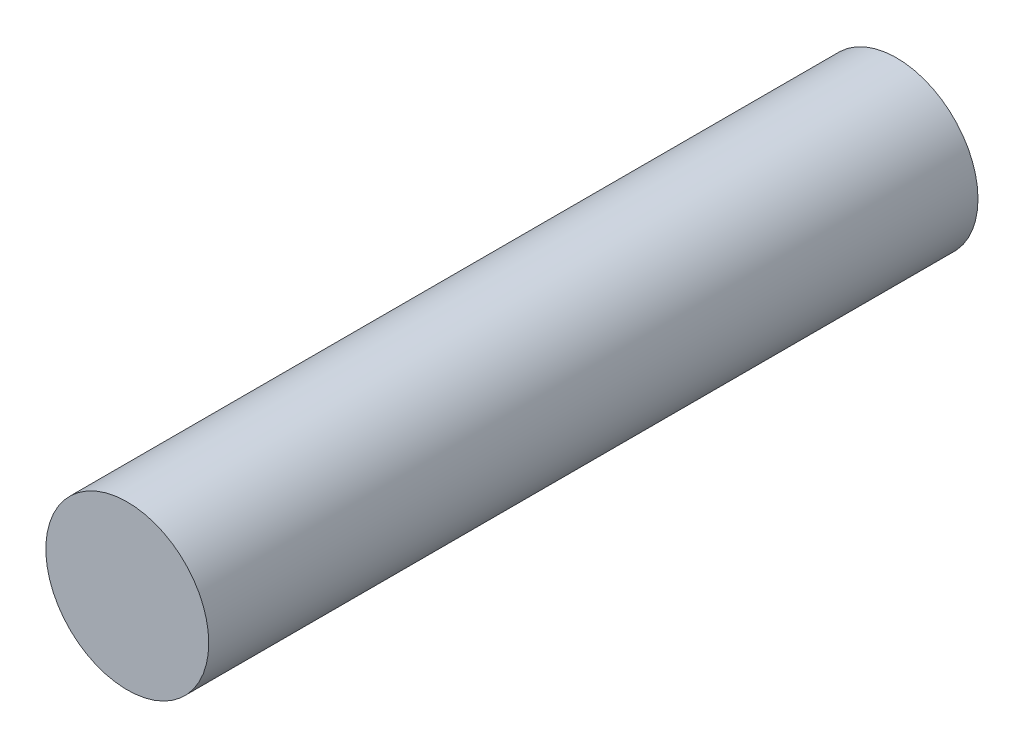
ISO-10303-21;
HEADER;
FILE_DESCRIPTION(('STEP AP214'),'2;1');
FILE_NAME('part.step','',(''),(''),'','','');
FILE_SCHEMA(('AUTOMOTIVE_DESIGN { 1 0 10303 214 1 1 1 1 }'));
ENDSEC;
DATA;
#1=APPLICATION_CONTEXT('core data for automotive mechanical design processes');
#2=APPLICATION_PROTOCOL_DEFINITION('international standard','automotive_design',2000,#1);
#3=PRODUCT_CONTEXT('',#1,'mechanical');
#4=PRODUCT('Part','Part','',(#3));
#5=PRODUCT_RELATED_PRODUCT_CATEGORY('part','',(#4));
#6=PRODUCT_DEFINITION_FORMATION('','',#4);
#7=PRODUCT_DEFINITION_CONTEXT('part definition',#1,'design');
#8=PRODUCT_DEFINITION('design','',#6,#7);
#9=PRODUCT_DEFINITION_SHAPE('','',#8);
#10=(LENGTH_UNIT() NAMED_UNIT(*) SI_UNIT(.MILLI.,.METRE.));
#11=(NAMED_UNIT(*) PLANE_ANGLE_UNIT() SI_UNIT($,.RADIAN.));
#12=(NAMED_UNIT(*) SI_UNIT($,.STERADIAN.) SOLID_ANGLE_UNIT());
#13=UNCERTAINTY_MEASURE_WITH_UNIT(LENGTH_MEASURE(1.E-05),#10,'distance_accuracy_value','');
#14=(GEOMETRIC_REPRESENTATION_CONTEXT(3) GLOBAL_UNCERTAINTY_ASSIGNED_CONTEXT((#13)) GLOBAL_UNIT_ASSIGNED_CONTEXT((#10,
#11,#12)) REPRESENTATION_CONTEXT('',''));
#15=CARTESIAN_POINT('',(0.,0.,0.));
#16=DIRECTION('',(0.,0.,1.));
#17=DIRECTION('',(1.,0.,0.));
#18=AXIS2_PLACEMENT_3D('',#15,#16,#17);
#19=CARTESIAN_POINT('',(0.,0.,17.));
#20=DIRECTION('',(0.,0.,-1.));
#21=DIRECTION('',(-1.,0.,0.));
#22=AXIS2_PLACEMENT_3D('',#19,#20,#21);
#23=CYLINDRICAL_SURFACE('',#22,1.8);
#24=CARTESIAN_POINT('',(0.,0.,17.));
#25=DIRECTION('',(0.,0.,1.));
#26=DIRECTION('',(1.,0.,0.));
#27=AXIS2_PLACEMENT_3D('',#24,#25,#26);
#28=CIRCLE('',#27,1.8);
#29=CARTESIAN_POINT('',(1.8,0.,17.));
#30=VERTEX_POINT('',#29);
#31=EDGE_CURVE('E10',#30,#30,#28,.T.);
#32=ORIENTED_EDGE('',*,*,#31,.F.);
#33=EDGE_LOOP('',(#32));
#34=FACE_BOUND('',#33,.T.);
#35=CARTESIAN_POINT('',(0.,0.,0.));
#36=DIRECTION('',(0.,0.,1.));
#37=DIRECTION('',(1.,0.,0.));
#38=AXIS2_PLACEMENT_3D('',#35,#36,#37);
#39=CIRCLE('',#38,1.8);
#40=CARTESIAN_POINT('',(1.8,0.,0.));
#41=VERTEX_POINT('',#40);
#42=EDGE_CURVE('E34',#41,#41,#39,.T.);
#43=ORIENTED_EDGE('',*,*,#42,.T.);
#44=EDGE_LOOP('',(#43));
#45=FACE_BOUND('',#44,.T.);
#46=ADVANCED_FACE('F31',(#34,#45),#23,.T.);
#47=CARTESIAN_POINT('',(0.,0.,17.));
#48=DIRECTION('',(0.,0.,1.));
#49=DIRECTION('',(1.,0.,0.));
#50=AXIS2_PLACEMENT_3D('',#47,#48,#49);
#51=PLANE('',#50);
#52=ORIENTED_EDGE('',*,*,#31,.T.);
#53=EDGE_LOOP('',(#52));
#54=FACE_BOUND('',#53,.T.);
#55=ADVANCED_FACE('F46',(#54),#51,.T.);
#56=CARTESIAN_POINT('',(0.,0.,0.));
#57=DIRECTION('',(0.,0.,1.));
#58=DIRECTION('',(1.,0.,0.));
#59=AXIS2_PLACEMENT_3D('',#56,#57,#58);
#60=PLANE('',#59);
#61=ORIENTED_EDGE('',*,*,#42,.F.);
#62=EDGE_LOOP('',(#61));
#63=FACE_BOUND('',#62,.T.);
#64=ADVANCED_FACE('F44',(#63),#60,.F.);
#65=CLOSED_SHELL('',(#46,#55,#64));
#66=MANIFOLD_SOLID_BREP('B2',#65);
#67=ADVANCED_BREP_SHAPE_REPRESENTATION('',(#18,#66),#14);
#68=SHAPE_DEFINITION_REPRESENTATION(#9,#67);
ENDSEC;
END-ISO-10303-21;
